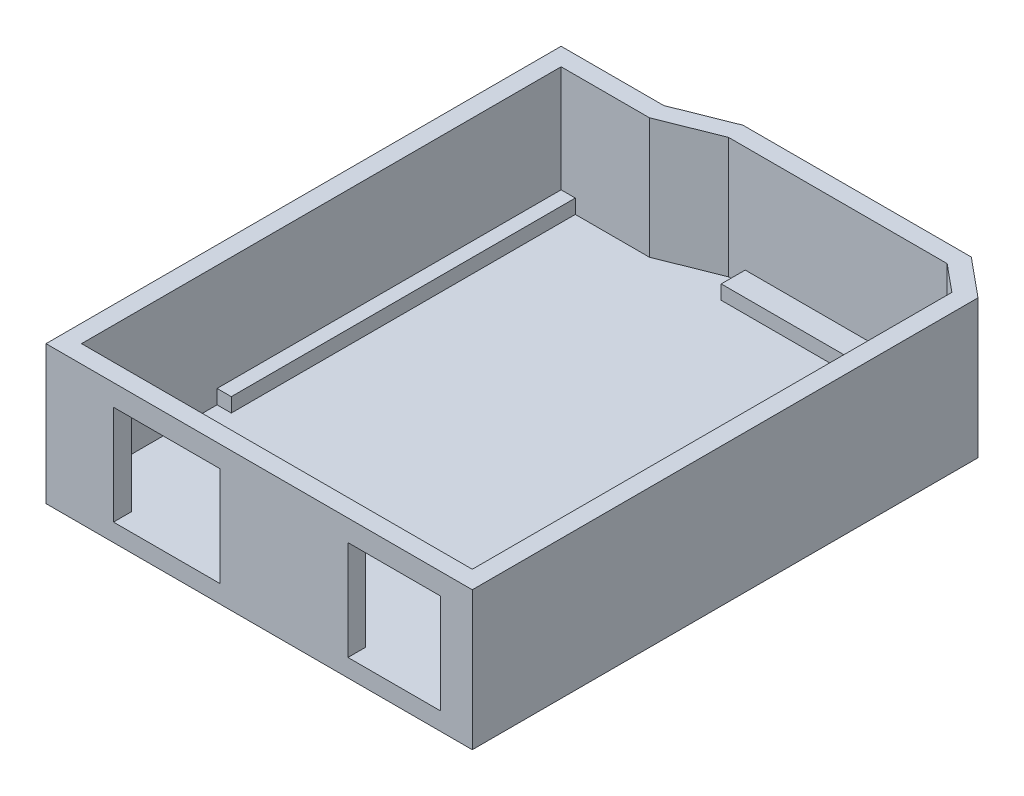
ISO-10303-21;
HEADER;
FILE_DESCRIPTION(('STEP AP214'),'2;1');
FILE_NAME('part.step','',(''),(''),'','','');
FILE_SCHEMA(('AUTOMOTIVE_DESIGN { 1 0 10303 214 1 1 1 1 }'));
ENDSEC;
DATA;
#1=APPLICATION_CONTEXT('core data for automotive mechanical design processes');
#2=APPLICATION_PROTOCOL_DEFINITION('international standard','automotive_design',2000,#1);
#3=PRODUCT_CONTEXT('',#1,'mechanical');
#4=PRODUCT('Part','Part','',(#3));
#5=PRODUCT_RELATED_PRODUCT_CATEGORY('part','',(#4));
#6=PRODUCT_DEFINITION_FORMATION('','',#4);
#7=PRODUCT_DEFINITION_CONTEXT('part definition',#1,'design');
#8=PRODUCT_DEFINITION('design','',#6,#7);
#9=PRODUCT_DEFINITION_SHAPE('','',#8);
#10=(LENGTH_UNIT() NAMED_UNIT(*) SI_UNIT(.MILLI.,.METRE.));
#11=(NAMED_UNIT(*) PLANE_ANGLE_UNIT() SI_UNIT($,.RADIAN.));
#12=(NAMED_UNIT(*) SI_UNIT($,.STERADIAN.) SOLID_ANGLE_UNIT());
#13=UNCERTAINTY_MEASURE_WITH_UNIT(LENGTH_MEASURE(1.E-05),#10,'distance_accuracy_value','');
#14=(GEOMETRIC_REPRESENTATION_CONTEXT(3) GLOBAL_UNCERTAINTY_ASSIGNED_CONTEXT((#13)) GLOBAL_UNIT_ASSIGNED_CONTEXT((#10,
#11,#12)) REPRESENTATION_CONTEXT('',''));
#15=CARTESIAN_POINT('',(0.,0.,0.));
#16=DIRECTION('',(0.,0.,1.));
#17=DIRECTION('',(1.,0.,0.));
#18=AXIS2_PLACEMENT_3D('',#15,#16,#17);
#19=CARTESIAN_POINT('',(0.,0.,0.));
#20=DIRECTION('',(0.,1.,0.));
#21=DIRECTION('',(0.,0.,1.));
#22=AXIS2_PLACEMENT_3D('',#19,#20,#21);
#23=PLANE('',#22);
#24=DIRECTION('',(1.,0.,0.));
#25=VECTOR('',#24,1.);
#26=CARTESIAN_POINT('',(22.7347806435726,0.,-67.3020667080368));
#27=LINE('',#26,#25);
#28=CARTESIAN_POINT('',(22.7347806435726,0.,-67.3020667080368));
#29=VERTEX_POINT('',#28);
#30=CARTESIAN_POINT('',(48.8818209057946,0.,-67.3020667080368));
#31=VERTEX_POINT('',#30);
#32=EDGE_CURVE('E919',#29,#31,#27,.T.);
#33=ORIENTED_EDGE('',*,*,#32,.F.);
#34=DIRECTION('',(0.,0.,1.));
#35=VECTOR('',#34,1.);
#36=CARTESIAN_POINT('',(22.7347806435726,0.,-67.3020667080368));
#37=LINE('',#36,#35);
#38=CARTESIAN_POINT('',(22.7347806435726,0.,-70.6768395355411));
#39=VERTEX_POINT('',#38);
#40=EDGE_CURVE('E278',#39,#29,#37,.T.);
#41=ORIENTED_EDGE('',*,*,#40,.F.);
#42=DIRECTION('',(-1.,0.,0.));
#43=VECTOR('',#42,1.);
#44=CARTESIAN_POINT('',(20.3927963137128,0.,-70.6768395355411));
#45=LINE('',#44,#43);
#46=CARTESIAN_POINT('',(20.3927963137128,0.,-70.6768395355411));
#47=VERTEX_POINT('',#46);
#48=EDGE_CURVE('E465',#39,#47,#45,.T.);
#49=ORIENTED_EDGE('',*,*,#48,.T.);
#50=DIRECTION('',(-0.928750661509082,0.,0.370705015809662));
#51=VECTOR('',#50,1.);
#52=CARTESIAN_POINT('',(12.4336598188969,0.,-67.5));
#53=LINE('',#52,#51);
#54=CARTESIAN_POINT('',(12.4336598188969,0.,-67.5));
#55=VERTEX_POINT('',#54);
#56=EDGE_CURVE('E470',#47,#55,#53,.T.);
#57=ORIENTED_EDGE('',*,*,#56,.T.);
#58=DIRECTION('',(-1.,0.,0.));
#59=VECTOR('',#58,1.);
#60=CARTESIAN_POINT('',(0.,0.,-67.5));
#61=LINE('',#60,#59);
#62=CARTESIAN_POINT('',(2.,0.,-67.5));
#63=VERTEX_POINT('',#62);
#64=EDGE_CURVE('E473',#55,#63,#61,.T.);
#65=ORIENTED_EDGE('',*,*,#64,.T.);
#66=DIRECTION('',(0.,0.,-1.));
#67=VECTOR('',#66,1.);
#68=CARTESIAN_POINT('',(2.,0.,-69.0781391182962));
#69=LINE('',#68,#67);
#70=CARTESIAN_POINT('',(2.00000000000001,0.,-19.0781391182962));
#71=VERTEX_POINT('',#70);
#72=EDGE_CURVE('E323',#71,#63,#69,.T.);
#73=ORIENTED_EDGE('',*,*,#72,.F.);
#74=DIRECTION('',(1.,0.,0.));
#75=VECTOR('',#74,1.);
#76=CARTESIAN_POINT('',(0.,0.,-19.0781391182962));
#77=LINE('',#76,#75);
#78=CARTESIAN_POINT('',(0.,0.,-19.0781391182962));
#79=VERTEX_POINT('',#78);
#80=EDGE_CURVE('E318',#79,#71,#77,.T.);
#81=ORIENTED_EDGE('',*,*,#80,.F.);
#82=DIRECTION('',(0.,0.,1.));
#83=VECTOR('',#82,1.);
#84=CARTESIAN_POINT('',(0.,0.,0.));
#85=LINE('',#84,#83);
#86=CARTESIAN_POINT('',(0.,0.,0.));
#87=VERTEX_POINT('',#86);
#88=EDGE_CURVE('E433',#79,#87,#85,.T.);
#89=ORIENTED_EDGE('',*,*,#88,.T.);
#90=DIRECTION('',(1.,0.,0.));
#91=VECTOR('',#90,1.);
#92=CARTESIAN_POINT('',(0.,0.,0.));
#93=LINE('',#92,#91);
#94=CARTESIAN_POINT('',(7.,0.,0.));
#95=VERTEX_POINT('',#94);
#96=EDGE_CURVE('E453',#87,#95,#93,.T.);
#97=ORIENTED_EDGE('',*,*,#96,.T.);
#98=DIRECTION('',(0.,0.,-1.));
#99=VECTOR('',#98,1.);
#100=CARTESIAN_POINT('',(7.,0.,4.));
#101=LINE('',#100,#99);
#102=CARTESIAN_POINT('',(7.,0.,2.5));
#103=VERTEX_POINT('',#102);
#104=EDGE_CURVE('E369',#103,#95,#101,.T.);
#105=ORIENTED_EDGE('',*,*,#104,.F.);
#106=DIRECTION('',(-1.,0.,0.));
#107=VECTOR('',#106,1.);
#108=CARTESIAN_POINT('',(0.,0.,2.5));
#109=LINE('',#108,#107);
#110=CARTESIAN_POINT('',(22.,0.,2.5));
#111=VERTEX_POINT('',#110);
#112=EDGE_CURVE('E412',#111,#103,#109,.T.);
#113=ORIENTED_EDGE('',*,*,#112,.F.);
#114=DIRECTION('',(0.,0.,-1.));
#115=VECTOR('',#114,1.);
#116=CARTESIAN_POINT('',(22.,0.,4.));
#117=LINE('',#116,#115);
#118=CARTESIAN_POINT('',(22.,0.,0.));
#119=VERTEX_POINT('',#118);
#120=EDGE_CURVE('E361',#111,#119,#117,.T.);
#121=ORIENTED_EDGE('',*,*,#120,.T.);
#122=CARTESIAN_POINT('',(40.,0.,0.));
#123=VERTEX_POINT('',#122);
#124=EDGE_CURVE('E458',#119,#123,#93,.T.);
#125=ORIENTED_EDGE('',*,*,#124,.T.);
#126=DIRECTION('',(0.,0.,-1.));
#127=VECTOR('',#126,1.);
#128=CARTESIAN_POINT('',(40.,0.,4.));
#129=LINE('',#128,#127);
#130=CARTESIAN_POINT('',(40.,0.,2.5));
#131=VERTEX_POINT('',#130);
#132=EDGE_CURVE('E353',#131,#123,#129,.T.);
#133=ORIENTED_EDGE('',*,*,#132,.F.);
#134=DIRECTION('',(-1.,0.,0.));
#135=VECTOR('',#134,1.);
#136=CARTESIAN_POINT('',(0.,0.,2.5));
#137=LINE('',#136,#135);
#138=CARTESIAN_POINT('',(53.,0.,2.5));
#139=VERTEX_POINT('',#138);
#140=EDGE_CURVE('E404',#139,#131,#137,.T.);
#141=ORIENTED_EDGE('',*,*,#140,.F.);
#142=DIRECTION('',(0.,0.,-1.));
#143=VECTOR('',#142,1.);
#144=CARTESIAN_POINT('',(53.,0.,4.));
#145=LINE('',#144,#143);
#146=CARTESIAN_POINT('',(53.,0.,0.));
#147=VERTEX_POINT('',#146);
#148=EDGE_CURVE('E388',#139,#147,#145,.T.);
#149=ORIENTED_EDGE('',*,*,#148,.T.);
#150=CARTESIAN_POINT('',(55.,0.,0.));
#151=VERTEX_POINT('',#150);
#152=EDGE_CURVE('E428',#147,#151,#93,.T.);
#153=ORIENTED_EDGE('',*,*,#152,.T.);
#154=DIRECTION('',(0.,0.,-1.));
#155=VECTOR('',#154,1.);
#156=CARTESIAN_POINT('',(55.,0.,0.));
#157=LINE('',#156,#155);
#158=CARTESIAN_POINT('',(55.,0.,-19.0781391182962));
#159=VERTEX_POINT('',#158);
#160=EDGE_CURVE('E457',#151,#159,#157,.T.);
#161=ORIENTED_EDGE('',*,*,#160,.T.);
#162=DIRECTION('',(1.,0.,0.));
#163=VECTOR('',#162,1.);
#164=CARTESIAN_POINT('',(55.,0.,-19.0781391182962));
#165=LINE('',#164,#163);
#166=CARTESIAN_POINT('',(53.,0.,-19.0781391182962));
#167=VERTEX_POINT('',#166);
#168=EDGE_CURVE('E293',#167,#159,#165,.T.);
#169=ORIENTED_EDGE('',*,*,#168,.F.);
#170=DIRECTION('',(0.,0.,1.));
#171=VECTOR('',#170,1.);
#172=CARTESIAN_POINT('',(53.,0.,-69.0781391182962));
#173=LINE('',#172,#171);
#174=CARTESIAN_POINT('',(53.,0.,-69.0781391182962));
#175=VERTEX_POINT('',#174);
#176=EDGE_CURVE('E285',#175,#167,#173,.T.);
#177=ORIENTED_EDGE('',*,*,#176,.F.);
#178=DIRECTION('',(-1.,0.,0.));
#179=VECTOR('',#178,1.);
#180=CARTESIAN_POINT('',(55.,0.,-69.0781391182962));
#181=LINE('',#180,#179);
#182=CARTESIAN_POINT('',(53.0913380999779,0.,-69.0781391182962));
#183=VERTEX_POINT('',#182);
#184=EDGE_CURVE('E281',#183,#175,#181,.T.);
#185=ORIENTED_EDGE('',*,*,#184,.F.);
#186=DIRECTION('',(-0.770680459779966,0.,-0.637221805114468));
#187=VECTOR('',#186,1.);
#188=CARTESIAN_POINT('',(55.,0.,-67.5));
#189=LINE('',#188,#187);
#190=CARTESIAN_POINT('',(51.1578085774102,0.,-70.6768395355411));
#191=VERTEX_POINT('',#190);
#192=EDGE_CURVE('E462',#183,#191,#189,.T.);
#193=ORIENTED_EDGE('',*,*,#192,.T.);
#194=CARTESIAN_POINT('',(48.8818209057946,0.,-70.6768395355411));
#195=VERTEX_POINT('',#194);
#196=EDGE_CURVE('E466',#191,#195,#45,.T.);
#197=ORIENTED_EDGE('',*,*,#196,.T.);
#198=DIRECTION('',(0.,0.,-1.));
#199=VECTOR('',#198,1.);
#200=CARTESIAN_POINT('',(48.8818209057946,0.,-67.3020667080368));
#201=LINE('',#200,#199);
#202=EDGE_CURVE('E274',#31,#195,#201,.T.);
#203=ORIENTED_EDGE('',*,*,#202,.F.);
#204=EDGE_LOOP('',(#33,#41,#49,#57,#65,#73,#81,#89,#97,#105,#113,#121,#125,#133,#141,#149,#153,
#161,#169,#177,#185,#193,#197,#203));
#205=FACE_BOUND('',#204,.T.);
#206=ADVANCED_FACE('F38',(#205),#23,.T.);
#207=CARTESIAN_POINT('',(20.3927963137128,17.,-70.6768395355411));
#208=DIRECTION('',(0.,0.,1.));
#209=DIRECTION('',(1.,0.,0.));
#210=AXIS2_PLACEMENT_3D('',#207,#208,#209);
#211=PLANE('',#210);
#212=ORIENTED_EDGE('',*,*,#48,.F.);
#213=DIRECTION('',(0.,-1.,0.));
#214=VECTOR('',#213,1.);
#215=CARTESIAN_POINT('',(22.7347806435726,2.,-70.6768395355411));
#216=LINE('',#215,#214);
#217=CARTESIAN_POINT('',(22.7347806435726,2.,-70.6768395355411));
#218=VERTEX_POINT('',#217);
#219=EDGE_CURVE('E925',#218,#39,#216,.T.);
#220=ORIENTED_EDGE('',*,*,#219,.F.);
#221=DIRECTION('',(-1.,0.,0.));
#222=VECTOR('',#221,1.);
#223=CARTESIAN_POINT('',(22.7347806435726,2.,-70.6768395355411));
#224=LINE('',#223,#222);
#225=CARTESIAN_POINT('',(48.8818209057946,2.,-70.6768395355411));
#226=VERTEX_POINT('',#225);
#227=EDGE_CURVE('E270',#226,#218,#224,.T.);
#228=ORIENTED_EDGE('',*,*,#227,.F.);
#229=DIRECTION('',(0.,-1.,0.));
#230=VECTOR('',#229,1.);
#231=CARTESIAN_POINT('',(48.8818209057946,2.,-70.6768395355411));
#232=LINE('',#231,#230);
#233=EDGE_CURVE('E54',#226,#195,#232,.T.);
#234=ORIENTED_EDGE('',*,*,#233,.T.);
#235=ORIENTED_EDGE('',*,*,#196,.F.);
#236=DIRECTION('',(0.,-1.,0.));
#237=VECTOR('',#236,1.);
#238=CARTESIAN_POINT('',(51.1578085774102,17.,-70.6768395355411));
#239=LINE('',#238,#237);
#240=CARTESIAN_POINT('',(51.1578085774102,17.,-70.6768395355411));
#241=VERTEX_POINT('',#240);
#242=EDGE_CURVE('E494',#241,#191,#239,.T.);
#243=ORIENTED_EDGE('',*,*,#242,.F.);
#244=DIRECTION('',(-1.,0.,0.));
#245=VECTOR('',#244,1.);
#246=CARTESIAN_POINT('',(20.3927963137128,17.,-70.6768395355411));
#247=LINE('',#246,#245);
#248=CARTESIAN_POINT('',(20.3927963137128,17.,-70.6768395355411));
#249=VERTEX_POINT('',#248);
#250=EDGE_CURVE('E439',#241,#249,#247,.T.);
#251=ORIENTED_EDGE('',*,*,#250,.T.);
#252=DIRECTION('',(0.,-1.,0.));
#253=VECTOR('',#252,1.);
#254=CARTESIAN_POINT('',(20.3927963137128,17.,-70.6768395355411));
#255=LINE('',#254,#253);
#256=EDGE_CURVE('E490',#249,#47,#255,.T.);
#257=ORIENTED_EDGE('',*,*,#256,.T.);
#258=EDGE_LOOP('',(#212,#220,#228,#234,#235,#243,#251,#257));
#259=FACE_BOUND('',#258,.T.);
#260=ADVANCED_FACE('F600',(#259),#211,.T.);
#261=CARTESIAN_POINT('',(55.,17.,0.));
#262=DIRECTION('',(-1.,0.,0.));
#263=DIRECTION('',(0.,0.,1.));
#264=AXIS2_PLACEMENT_3D('',#261,#262,#263);
#265=PLANE('',#264);
#266=DIRECTION('',(0.,0.,-1.));
#267=VECTOR('',#266,1.);
#268=CARTESIAN_POINT('',(55.,2.,-69.0781391182962));
#269=LINE('',#268,#267);
#270=CARTESIAN_POINT('',(55.,2.,-19.0781391182962));
#271=VERTEX_POINT('',#270);
#272=CARTESIAN_POINT('',(55.,2.,-67.5));
#273=VERTEX_POINT('',#272);
#274=EDGE_CURVE('E62',#271,#273,#269,.T.);
#275=ORIENTED_EDGE('',*,*,#274,.F.);
#276=DIRECTION('',(0.,-1.,0.));
#277=VECTOR('',#276,1.);
#278=CARTESIAN_POINT('',(55.,2.,-19.0781391182962));
#279=LINE('',#278,#277);
#280=EDGE_CURVE('E301',#271,#159,#279,.T.);
#281=ORIENTED_EDGE('',*,*,#280,.T.);
#282=ORIENTED_EDGE('',*,*,#160,.F.);
#283=DIRECTION('',(0.,-1.,0.));
#284=VECTOR('',#283,1.);
#285=CARTESIAN_POINT('',(55.,17.,0.));
#286=LINE('',#285,#284);
#287=CARTESIAN_POINT('',(55.,17.,0.));
#288=VERTEX_POINT('',#287);
#289=EDGE_CURVE('E502',#288,#151,#286,.T.);
#290=ORIENTED_EDGE('',*,*,#289,.F.);
#291=DIRECTION('',(0.,0.,-1.));
#292=VECTOR('',#291,1.);
#293=CARTESIAN_POINT('',(55.,17.,0.));
#294=LINE('',#293,#292);
#295=CARTESIAN_POINT('',(55.,17.,-67.5));
#296=VERTEX_POINT('',#295);
#297=EDGE_CURVE('E432',#288,#296,#294,.T.);
#298=ORIENTED_EDGE('',*,*,#297,.T.);
#299=DIRECTION('',(0.,-1.,0.));
#300=VECTOR('',#299,1.);
#301=CARTESIAN_POINT('',(55.,17.,-67.5));
#302=LINE('',#301,#300);
#303=EDGE_CURVE('E498',#296,#273,#302,.T.);
#304=ORIENTED_EDGE('',*,*,#303,.T.);
#305=EDGE_LOOP('',(#275,#281,#282,#290,#298,#304));
#306=FACE_BOUND('',#305,.T.);
#307=ADVANCED_FACE('F585',(#306),#265,.T.);
#308=CARTESIAN_POINT('',(55.,17.,-67.5));
#309=DIRECTION('',(-0.637221805114468,0.,0.770680459779966));
#310=DIRECTION('',(0.770680459779966,0.,0.637221805114468));
#311=AXIS2_PLACEMENT_3D('',#308,#309,#310);
#312=PLANE('',#311);
#313=ORIENTED_EDGE('',*,*,#192,.F.);
#314=DIRECTION('',(0.,1.,0.));
#315=VECTOR('',#314,1.);
#316=CARTESIAN_POINT('',(53.0913380999779,17.,-69.0781391182962));
#317=LINE('',#316,#315);
#318=CARTESIAN_POINT('',(53.0913380999779,2.,-69.0781391182962));
#319=VERTEX_POINT('',#318);
#320=EDGE_CURVE('E11',#183,#319,#317,.T.);
#321=ORIENTED_EDGE('',*,*,#320,.T.);
#322=DIRECTION('',(0.770680459779966,0.,0.637221805114468));
#323=VECTOR('',#322,1.);
#324=CARTESIAN_POINT('',(55.,2.,-67.5));
#325=LINE('',#324,#323);
#326=EDGE_CURVE('E47',#319,#273,#325,.T.);
#327=ORIENTED_EDGE('',*,*,#326,.T.);
#328=ORIENTED_EDGE('',*,*,#303,.F.);
#329=DIRECTION('',(-0.770680459779966,0.,-0.637221805114468));
#330=VECTOR('',#329,1.);
#331=CARTESIAN_POINT('',(55.,17.,-67.5));
#332=LINE('',#331,#330);
#333=EDGE_CURVE('E436',#296,#241,#332,.T.);
#334=ORIENTED_EDGE('',*,*,#333,.T.);
#335=ORIENTED_EDGE('',*,*,#242,.T.);
#336=EDGE_LOOP('',(#313,#321,#327,#328,#334,#335));
#337=FACE_BOUND('',#336,.T.);
#338=ADVANCED_FACE('F581',(#337),#312,.T.);
#339=CARTESIAN_POINT('',(0.,17.,-67.5));
#340=DIRECTION('',(0.,0.,1.));
#341=DIRECTION('',(1.,0.,0.));
#342=AXIS2_PLACEMENT_3D('',#339,#340,#341);
#343=PLANE('',#342);
#344=DIRECTION('',(-1.,0.,0.));
#345=VECTOR('',#344,1.);
#346=CARTESIAN_POINT('',(0.,2.,-67.5));
#347=LINE('',#346,#345);
#348=CARTESIAN_POINT('',(2.,2.,-67.5));
#349=VERTEX_POINT('',#348);
#350=CARTESIAN_POINT('',(0.,2.,-67.5));
#351=VERTEX_POINT('',#350);
#352=EDGE_CURVE('E345',#349,#351,#347,.T.);
#353=ORIENTED_EDGE('',*,*,#352,.F.);
#354=DIRECTION('',(0.,-1.,0.));
#355=VECTOR('',#354,1.);
#356=CARTESIAN_POINT('',(2.,17.,-67.5));
#357=LINE('',#356,#355);
#358=EDGE_CURVE('E341',#349,#63,#357,.T.);
#359=ORIENTED_EDGE('',*,*,#358,.T.);
#360=ORIENTED_EDGE('',*,*,#64,.F.);
#361=DIRECTION('',(0.,-1.,0.));
#362=VECTOR('',#361,1.);
#363=CARTESIAN_POINT('',(12.4336598188969,17.,-67.5));
#364=LINE('',#363,#362);
#365=CARTESIAN_POINT('',(12.4336598188969,17.,-67.5));
#366=VERTEX_POINT('',#365);
#367=EDGE_CURVE('E486',#366,#55,#364,.T.);
#368=ORIENTED_EDGE('',*,*,#367,.F.);
#369=DIRECTION('',(-1.,0.,0.));
#370=VECTOR('',#369,1.);
#371=CARTESIAN_POINT('',(0.,17.,-67.5));
#372=LINE('',#371,#370);
#373=CARTESIAN_POINT('',(0.,17.,-67.5));
#374=VERTEX_POINT('',#373);
#375=EDGE_CURVE('E445',#366,#374,#372,.T.);
#376=ORIENTED_EDGE('',*,*,#375,.T.);
#377=DIRECTION('',(0.,-1.,0.));
#378=VECTOR('',#377,1.);
#379=CARTESIAN_POINT('',(0.,17.,-67.5));
#380=LINE('',#379,#378);
#381=EDGE_CURVE('E482',#374,#351,#380,.T.);
#382=ORIENTED_EDGE('',*,*,#381,.T.);
#383=EDGE_LOOP('',(#353,#359,#360,#368,#376,#382));
#384=FACE_BOUND('',#383,.T.);
#385=ADVANCED_FACE('F667',(#384),#343,.T.);
#386=CARTESIAN_POINT('',(0.,17.,0.));
#387=DIRECTION('',(1.,0.,0.));
#388=DIRECTION('',(0.,0.,-1.));
#389=AXIS2_PLACEMENT_3D('',#386,#387,#388);
#390=PLANE('',#389);
#391=ORIENTED_EDGE('',*,*,#88,.F.);
#392=DIRECTION('',(0.,-1.,0.));
#393=VECTOR('',#392,1.);
#394=CARTESIAN_POINT('',(0.,2.,-19.0781391182962));
#395=LINE('',#394,#393);
#396=CARTESIAN_POINT('',(0.,2.,-19.0781391182962));
#397=VERTEX_POINT('',#396);
#398=EDGE_CURVE('E338',#397,#79,#395,.T.);
#399=ORIENTED_EDGE('',*,*,#398,.F.);
#400=DIRECTION('',(0.,0.,1.));
#401=VECTOR('',#400,1.);
#402=CARTESIAN_POINT('',(0.,2.,-69.0781391182962));
#403=LINE('',#402,#401);
#404=EDGE_CURVE('E319',#351,#397,#403,.T.);
#405=ORIENTED_EDGE('',*,*,#404,.F.);
#406=ORIENTED_EDGE('',*,*,#381,.F.);
#407=DIRECTION('',(0.,0.,1.));
#408=VECTOR('',#407,1.);
#409=CARTESIAN_POINT('',(0.,17.,0.));
#410=LINE('',#409,#408);
#411=CARTESIAN_POINT('',(0.,17.,0.));
#412=VERTEX_POINT('',#411);
#413=EDGE_CURVE('E449',#374,#412,#410,.T.);
#414=ORIENTED_EDGE('',*,*,#413,.T.);
#415=DIRECTION('',(0.,-1.,0.));
#416=VECTOR('',#415,1.);
#417=CARTESIAN_POINT('',(0.,17.,0.));
#418=LINE('',#417,#416);
#419=EDGE_CURVE('E452',#412,#87,#418,.T.);
#420=ORIENTED_EDGE('',*,*,#419,.T.);
#421=EDGE_LOOP('',(#391,#399,#405,#406,#414,#420));
#422=FACE_BOUND('',#421,.T.);
#423=ADVANCED_FACE('F664',(#422),#390,.T.);
#424=CARTESIAN_POINT('',(0.,17.,2.5));
#425=DIRECTION('',(0.,0.,-1.));
#426=DIRECTION('',(-1.,0.,0.));
#427=AXIS2_PLACEMENT_3D('',#424,#425,#426);
#428=PLANE('',#427);
#429=DIRECTION('',(1.,0.,0.));
#430=VECTOR('',#429,1.);
#431=CARTESIAN_POINT('',(0.,14.,2.5));
#432=LINE('',#431,#430);
#433=CARTESIAN_POINT('',(7.,14.,2.5));
#434=VERTEX_POINT('',#433);
#435=CARTESIAN_POINT('',(22.,14.,2.5));
#436=VERTEX_POINT('',#435);
#437=EDGE_CURVE('E420',#434,#436,#432,.T.);
#438=ORIENTED_EDGE('',*,*,#437,.T.);
#439=DIRECTION('',(0.,-1.,0.));
#440=VECTOR('',#439,1.);
#441=CARTESIAN_POINT('',(22.,17.,2.5));
#442=LINE('',#441,#440);
#443=EDGE_CURVE('E424',#436,#111,#442,.T.);
#444=ORIENTED_EDGE('',*,*,#443,.T.);
#445=ORIENTED_EDGE('',*,*,#112,.T.);
#446=DIRECTION('',(0.,1.,0.));
#447=VECTOR('',#446,1.);
#448=CARTESIAN_POINT('',(7.,17.,2.5));
#449=LINE('',#448,#447);
#450=EDGE_CURVE('E416',#103,#434,#449,.T.);
#451=ORIENTED_EDGE('',*,*,#450,.T.);
#452=EDGE_LOOP('',(#438,#444,#445,#451));
#453=FACE_BOUND('',#452,.T.);
#454=ORIENTED_EDGE('',*,*,#140,.T.);
#455=DIRECTION('',(0.,1.,0.));
#456=VECTOR('',#455,1.);
#457=CARTESIAN_POINT('',(40.,17.,2.5));
#458=LINE('',#457,#456);
#459=CARTESIAN_POINT('',(40.,14.,2.5));
#460=VERTEX_POINT('',#459);
#461=EDGE_CURVE('E408',#131,#460,#458,.T.);
#462=ORIENTED_EDGE('',*,*,#461,.T.);
#463=DIRECTION('',(1.,0.,0.));
#464=VECTOR('',#463,1.);
#465=CARTESIAN_POINT('',(0.,14.,2.5));
#466=LINE('',#465,#464);
#467=CARTESIAN_POINT('',(53.,14.,2.5));
#468=VERTEX_POINT('',#467);
#469=EDGE_CURVE('E365',#460,#468,#466,.T.);
#470=ORIENTED_EDGE('',*,*,#469,.T.);
#471=DIRECTION('',(0.,-1.,0.));
#472=VECTOR('',#471,1.);
#473=CARTESIAN_POINT('',(53.,17.,2.5));
#474=LINE('',#473,#472);
#475=EDGE_CURVE('E400',#468,#139,#474,.T.);
#476=ORIENTED_EDGE('',*,*,#475,.T.);
#477=EDGE_LOOP('',(#454,#462,#470,#476));
#478=FACE_BOUND('',#477,.T.);
#479=DIRECTION('',(1.,0.,0.));
#480=VECTOR('',#479,1.);
#481=CARTESIAN_POINT('',(0.,-2.5,2.5));
#482=LINE('',#481,#480);
#483=CARTESIAN_POINT('',(-2.5,-2.5,2.5));
#484=VERTEX_POINT('',#483);
#485=CARTESIAN_POINT('',(57.5,-2.5,2.5));
#486=VERTEX_POINT('',#485);
#487=EDGE_CURVE('E506',#484,#486,#482,.T.);
#488=ORIENTED_EDGE('',*,*,#487,.T.);
#489=DIRECTION('',(0.,-1.,0.));
#490=VECTOR('',#489,1.);
#491=CARTESIAN_POINT('',(57.5,17.,2.5));
#492=LINE('',#491,#490);
#493=CARTESIAN_POINT('',(57.5,17.,2.5));
#494=VERTEX_POINT('',#493);
#495=EDGE_CURVE('E511',#494,#486,#492,.T.);
#496=ORIENTED_EDGE('',*,*,#495,.F.);
#497=DIRECTION('',(1.,0.,0.));
#498=VECTOR('',#497,1.);
#499=CARTESIAN_POINT('',(0.,17.,2.5));
#500=LINE('',#499,#498);
#501=CARTESIAN_POINT('',(-2.5,17.,2.5));
#502=VERTEX_POINT('',#501);
#503=EDGE_CURVE('E557',#502,#494,#500,.T.);
#504=ORIENTED_EDGE('',*,*,#503,.F.);
#505=DIRECTION('',(0.,-1.,0.));
#506=VECTOR('',#505,1.);
#507=CARTESIAN_POINT('',(-2.5,17.,2.5));
#508=LINE('',#507,#506);
#509=EDGE_CURVE('E516',#502,#484,#508,.T.);
#510=ORIENTED_EDGE('',*,*,#509,.T.);
#511=EDGE_LOOP('',(#488,#496,#504,#510));
#512=FACE_BOUND('',#511,.T.);
#513=ADVANCED_FACE('F638',(#453,#478,#512),#428,.F.);
#514=CARTESIAN_POINT('',(57.5,17.,0.));
#515=DIRECTION('',(-1.,0.,0.));
#516=DIRECTION('',(0.,0.,1.));
#517=AXIS2_PLACEMENT_3D('',#514,#515,#516);
#518=PLANE('',#517);
#519=DIRECTION('',(0.,0.,-1.));
#520=VECTOR('',#519,1.);
#521=CARTESIAN_POINT('',(57.5,-2.5,0.));
#522=LINE('',#521,#520);
#523=CARTESIAN_POINT('',(57.5,-2.5,-68.6768113174593));
#524=VERTEX_POINT('',#523);
#525=EDGE_CURVE('E510',#486,#524,#522,.T.);
#526=ORIENTED_EDGE('',*,*,#525,.T.);
#527=DIRECTION('',(0.,-1.,0.));
#528=VECTOR('',#527,1.);
#529=CARTESIAN_POINT('',(57.5,17.,-68.6768113174593));
#530=LINE('',#529,#528);
#531=CARTESIAN_POINT('',(57.5,17.,-68.6768113174593));
#532=VERTEX_POINT('',#531);
#533=EDGE_CURVE('E515',#532,#524,#530,.T.);
#534=ORIENTED_EDGE('',*,*,#533,.F.);
#535=DIRECTION('',(0.,0.,-1.));
#536=VECTOR('',#535,1.);
#537=CARTESIAN_POINT('',(57.5,17.,0.));
#538=LINE('',#537,#536);
#539=EDGE_CURVE('E561',#494,#532,#538,.T.);
#540=ORIENTED_EDGE('',*,*,#539,.F.);
#541=ORIENTED_EDGE('',*,*,#495,.T.);
#542=EDGE_LOOP('',(#526,#534,#540,#541));
#543=FACE_BOUND('',#542,.T.);
#544=ADVANCED_FACE('F687',(#543),#518,.F.);
#545=CARTESIAN_POINT('',(56.5930545127862,17.,-69.4267011494499));
#546=DIRECTION('',(-0.637221805114468,0.,0.770680459779966));
#547=DIRECTION('',(0.770680459779966,0.,0.637221805114468));
#548=AXIS2_PLACEMENT_3D('',#545,#546,#547);
#549=PLANE('',#548);
#550=DIRECTION('',(-0.770680459779966,0.,-0.637221805114468));
#551=VECTOR('',#550,1.);
#552=CARTESIAN_POINT('',(56.5930545127862,-2.5,-69.4267011494499));
#553=LINE('',#552,#551);
#554=CARTESIAN_POINT('',(52.0574935002247,-2.5,-73.1768395355411));
#555=VERTEX_POINT('',#554);
#556=EDGE_CURVE('E524',#524,#555,#553,.T.);
#557=ORIENTED_EDGE('',*,*,#556,.T.);
#558=DIRECTION('',(0.,-1.,0.));
#559=VECTOR('',#558,1.);
#560=CARTESIAN_POINT('',(52.0574935002247,17.,-73.1768395355411));
#561=LINE('',#560,#559);
#562=CARTESIAN_POINT('',(52.0574935002247,17.,-73.1768395355411));
#563=VERTEX_POINT('',#562);
#564=EDGE_CURVE('E528',#563,#555,#561,.T.);
#565=ORIENTED_EDGE('',*,*,#564,.F.);
#566=DIRECTION('',(-0.770680459779966,0.,-0.637221805114468));
#567=VECTOR('',#566,1.);
#568=CARTESIAN_POINT('',(56.5930545127862,17.,-69.4267011494499));
#569=LINE('',#568,#567);
#570=EDGE_CURVE('E564',#532,#563,#569,.T.);
#571=ORIENTED_EDGE('',*,*,#570,.F.);
#572=ORIENTED_EDGE('',*,*,#533,.T.);
#573=EDGE_LOOP('',(#557,#565,#571,#572));
#574=FACE_BOUND('',#573,.T.);
#575=ADVANCED_FACE('F691',(#574),#549,.F.);
#576=CARTESIAN_POINT('',(20.3927963137128,17.,-73.1768395355411));
#577=DIRECTION('',(0.,0.,1.));
#578=DIRECTION('',(1.,0.,0.));
#579=AXIS2_PLACEMENT_3D('',#576,#577,#578);
#580=PLANE('',#579);
#581=DIRECTION('',(-1.,0.,0.));
#582=VECTOR('',#581,1.);
#583=CARTESIAN_POINT('',(20.3927963137128,-2.5,-73.1768395355411));
#584=LINE('',#583,#582);
#585=CARTESIAN_POINT('',(19.9122974301511,-2.5,-73.1768395355411));
#586=VERTEX_POINT('',#585);
#587=EDGE_CURVE('E531',#555,#586,#584,.T.);
#588=ORIENTED_EDGE('',*,*,#587,.T.);
#589=DIRECTION('',(0.,-1.,0.));
#590=VECTOR('',#589,1.);
#591=CARTESIAN_POINT('',(19.9122974301511,17.,-73.1768395355411));
#592=LINE('',#591,#590);
#593=CARTESIAN_POINT('',(19.9122974301511,17.,-73.1768395355411));
#594=VERTEX_POINT('',#593);
#595=EDGE_CURVE('E535',#594,#586,#592,.T.);
#596=ORIENTED_EDGE('',*,*,#595,.F.);
#597=DIRECTION('',(-1.,0.,0.));
#598=VECTOR('',#597,1.);
#599=CARTESIAN_POINT('',(20.3927963137128,17.,-73.1768395355411));
#600=LINE('',#599,#598);
#601=EDGE_CURVE('E567',#563,#594,#600,.T.);
#602=ORIENTED_EDGE('',*,*,#601,.F.);
#603=ORIENTED_EDGE('',*,*,#564,.T.);
#604=EDGE_LOOP('',(#588,#596,#602,#603));
#605=FACE_BOUND('',#604,.T.);
#606=ADVANCED_FACE('F695',(#605),#580,.F.);
#607=CARTESIAN_POINT('',(11.5068972793727,17.,-69.8218766537727));
#608=DIRECTION('',(0.370705015809662,0.,0.928750661509083));
#609=DIRECTION('',(0.928750661509082,0.,-0.370705015809662));
#610=AXIS2_PLACEMENT_3D('',#607,#608,#609);
#611=PLANE('',#610);
#612=DIRECTION('',(-0.928750661509082,0.,0.370705015809662));
#613=VECTOR('',#612,1.);
#614=CARTESIAN_POINT('',(11.5068972793727,-2.5,-69.8218766537727));
#615=LINE('',#614,#613);
#616=CARTESIAN_POINT('',(11.9531609353351,-2.5,-70.));
#617=VERTEX_POINT('',#616);
#618=EDGE_CURVE('E538',#586,#617,#615,.T.);
#619=ORIENTED_EDGE('',*,*,#618,.T.);
#620=DIRECTION('',(0.,-1.,0.));
#621=VECTOR('',#620,1.);
#622=CARTESIAN_POINT('',(11.9531609353351,17.,-70.));
#623=LINE('',#622,#621);
#624=CARTESIAN_POINT('',(11.9531609353351,17.,-70.));
#625=VERTEX_POINT('',#624);
#626=EDGE_CURVE('E542',#625,#617,#623,.T.);
#627=ORIENTED_EDGE('',*,*,#626,.F.);
#628=DIRECTION('',(-0.928750661509082,0.,0.370705015809662));
#629=VECTOR('',#628,1.);
#630=CARTESIAN_POINT('',(11.5068972793727,17.,-69.8218766537727));
#631=LINE('',#630,#629);
#632=EDGE_CURVE('E570',#594,#625,#631,.T.);
#633=ORIENTED_EDGE('',*,*,#632,.F.);
#634=ORIENTED_EDGE('',*,*,#595,.T.);
#635=EDGE_LOOP('',(#619,#627,#633,#634));
#636=FACE_BOUND('',#635,.T.);
#637=ADVANCED_FACE('F699',(#636),#611,.F.);
#638=CARTESIAN_POINT('',(0.,17.,-70.));
#639=DIRECTION('',(0.,0.,1.));
#640=DIRECTION('',(1.,0.,0.));
#641=AXIS2_PLACEMENT_3D('',#638,#639,#640);
#642=PLANE('',#641);
#643=DIRECTION('',(-1.,0.,0.));
#644=VECTOR('',#643,1.);
#645=CARTESIAN_POINT('',(0.,-2.5,-70.));
#646=LINE('',#645,#644);
#647=CARTESIAN_POINT('',(-2.5,-2.5,-70.));
#648=VERTEX_POINT('',#647);
#649=EDGE_CURVE('E545',#617,#648,#646,.T.);
#650=ORIENTED_EDGE('',*,*,#649,.T.);
#651=DIRECTION('',(0.,-1.,0.));
#652=VECTOR('',#651,1.);
#653=CARTESIAN_POINT('',(-2.5,17.,-70.));
#654=LINE('',#653,#652);
#655=CARTESIAN_POINT('',(-2.5,17.,-70.));
#656=VERTEX_POINT('',#655);
#657=EDGE_CURVE('E520',#656,#648,#654,.T.);
#658=ORIENTED_EDGE('',*,*,#657,.F.);
#659=DIRECTION('',(-1.,0.,0.));
#660=VECTOR('',#659,1.);
#661=CARTESIAN_POINT('',(0.,17.,-70.));
#662=LINE('',#661,#660);
#663=EDGE_CURVE('E573',#625,#656,#662,.T.);
#664=ORIENTED_EDGE('',*,*,#663,.F.);
#665=ORIENTED_EDGE('',*,*,#626,.T.);
#666=EDGE_LOOP('',(#650,#658,#664,#665));
#667=FACE_BOUND('',#666,.T.);
#668=ADVANCED_FACE('F703',(#667),#642,.F.);
#669=CARTESIAN_POINT('',(-2.5,17.,0.));
#670=DIRECTION('',(1.,0.,0.));
#671=DIRECTION('',(0.,0.,-1.));
#672=AXIS2_PLACEMENT_3D('',#669,#670,#671);
#673=PLANE('',#672);
#674=DIRECTION('',(0.,0.,1.));
#675=VECTOR('',#674,1.);
#676=CARTESIAN_POINT('',(-2.5,-2.5,0.));
#677=LINE('',#676,#675);
#678=EDGE_CURVE('E551',#648,#484,#677,.T.);
#679=ORIENTED_EDGE('',*,*,#678,.T.);
#680=ORIENTED_EDGE('',*,*,#509,.F.);
#681=DIRECTION('',(0.,0.,1.));
#682=VECTOR('',#681,1.);
#683=CARTESIAN_POINT('',(-2.5,17.,0.));
#684=LINE('',#683,#682);
#685=EDGE_CURVE('E521',#656,#502,#684,.T.);
#686=ORIENTED_EDGE('',*,*,#685,.F.);
#687=ORIENTED_EDGE('',*,*,#657,.T.);
#688=EDGE_LOOP('',(#679,#680,#686,#687));
#689=FACE_BOUND('',#688,.T.);
#690=ADVANCED_FACE('F684',(#689),#673,.F.);
#691=CARTESIAN_POINT('',(0.,17.,0.));
#692=DIRECTION('',(0.,1.,0.));
#693=DIRECTION('',(0.,0.,1.));
#694=AXIS2_PLACEMENT_3D('',#691,#692,#693);
#695=PLANE('',#694);
#696=DIRECTION('',(1.,0.,0.));
#697=VECTOR('',#696,1.);
#698=CARTESIAN_POINT('',(0.,17.,0.));
#699=LINE('',#698,#697);
#700=EDGE_CURVE('E429',#412,#288,#699,.T.);
#701=ORIENTED_EDGE('',*,*,#700,.F.);
#702=ORIENTED_EDGE('',*,*,#413,.F.);
#703=ORIENTED_EDGE('',*,*,#375,.F.);
#704=DIRECTION('',(-0.928750661509082,0.,0.370705015809662));
#705=VECTOR('',#704,1.);
#706=CARTESIAN_POINT('',(12.4336598188969,17.,-67.5));
#707=LINE('',#706,#705);
#708=EDGE_CURVE('E442',#249,#366,#707,.T.);
#709=ORIENTED_EDGE('',*,*,#708,.F.);
#710=ORIENTED_EDGE('',*,*,#250,.F.);
#711=ORIENTED_EDGE('',*,*,#333,.F.);
#712=ORIENTED_EDGE('',*,*,#297,.F.);
#713=EDGE_LOOP('',(#701,#702,#703,#709,#710,#711,#712));
#714=FACE_BOUND('',#713,.T.);
#715=ORIENTED_EDGE('',*,*,#503,.T.);
#716=ORIENTED_EDGE('',*,*,#539,.T.);
#717=ORIENTED_EDGE('',*,*,#570,.T.);
#718=ORIENTED_EDGE('',*,*,#601,.T.);
#719=ORIENTED_EDGE('',*,*,#632,.T.);
#720=ORIENTED_EDGE('',*,*,#663,.T.);
#721=ORIENTED_EDGE('',*,*,#685,.T.);
#722=EDGE_LOOP('',(#715,#716,#717,#718,#719,#720,#721));
#723=FACE_BOUND('',#722,.T.);
#724=ADVANCED_FACE('F591',(#714,#723),#695,.T.);
#725=CARTESIAN_POINT('',(0.,-2.5,0.));
#726=DIRECTION('',(0.,1.,0.));
#727=DIRECTION('',(0.,0.,1.));
#728=AXIS2_PLACEMENT_3D('',#725,#726,#727);
#729=PLANE('',#728);
#730=ORIENTED_EDGE('',*,*,#487,.F.);
#731=ORIENTED_EDGE('',*,*,#678,.F.);
#732=ORIENTED_EDGE('',*,*,#649,.F.);
#733=ORIENTED_EDGE('',*,*,#618,.F.);
#734=ORIENTED_EDGE('',*,*,#587,.F.);
#735=ORIENTED_EDGE('',*,*,#556,.F.);
#736=ORIENTED_EDGE('',*,*,#525,.F.);
#737=EDGE_LOOP('',(#730,#731,#732,#733,#734,#735,#736));
#738=FACE_BOUND('',#737,.T.);
#739=ADVANCED_FACE('F40',(#738),#729,.F.);
#740=CARTESIAN_POINT('',(0.,17.,0.));
#741=DIRECTION('',(0.,0.,-1.));
#742=DIRECTION('',(-1.,0.,0.));
#743=AXIS2_PLACEMENT_3D('',#740,#741,#742);
#744=PLANE('',#743);
#745=DIRECTION('',(0.,-1.,0.));
#746=VECTOR('',#745,1.);
#747=CARTESIAN_POINT('',(22.,14.,0.));
#748=LINE('',#747,#746);
#749=CARTESIAN_POINT('',(22.,14.,0.));
#750=VERTEX_POINT('',#749);
#751=EDGE_CURVE('E349',#750,#119,#748,.T.);
#752=ORIENTED_EDGE('',*,*,#751,.F.);
#753=DIRECTION('',(1.,0.,0.));
#754=VECTOR('',#753,1.);
#755=CARTESIAN_POINT('',(22.,14.,0.));
#756=LINE('',#755,#754);
#757=CARTESIAN_POINT('',(7.,14.,0.));
#758=VERTEX_POINT('',#757);
#759=EDGE_CURVE('E357',#758,#750,#756,.T.);
#760=ORIENTED_EDGE('',*,*,#759,.F.);
#761=DIRECTION('',(0.,1.,0.));
#762=VECTOR('',#761,1.);
#763=CARTESIAN_POINT('',(7.,14.,0.));
#764=LINE('',#763,#762);
#765=EDGE_CURVE('E352',#95,#758,#764,.T.);
#766=ORIENTED_EDGE('',*,*,#765,.F.);
#767=ORIENTED_EDGE('',*,*,#96,.F.);
#768=ORIENTED_EDGE('',*,*,#419,.F.);
#769=ORIENTED_EDGE('',*,*,#700,.T.);
#770=ORIENTED_EDGE('',*,*,#289,.T.);
#771=ORIENTED_EDGE('',*,*,#152,.F.);
#772=DIRECTION('',(0.,-1.,0.));
#773=VECTOR('',#772,1.);
#774=CARTESIAN_POINT('',(53.,14.,0.));
#775=LINE('',#774,#773);
#776=CARTESIAN_POINT('',(53.,14.,0.));
#777=VERTEX_POINT('',#776);
#778=EDGE_CURVE('E382',#777,#147,#775,.T.);
#779=ORIENTED_EDGE('',*,*,#778,.F.);
#780=DIRECTION('',(1.,0.,0.));
#781=VECTOR('',#780,1.);
#782=CARTESIAN_POINT('',(40.,14.,0.));
#783=LINE('',#782,#781);
#784=CARTESIAN_POINT('',(40.,14.,0.));
#785=VERTEX_POINT('',#784);
#786=EDGE_CURVE('E378',#785,#777,#783,.T.);
#787=ORIENTED_EDGE('',*,*,#786,.F.);
#788=DIRECTION('',(0.,1.,0.));
#789=VECTOR('',#788,1.);
#790=CARTESIAN_POINT('',(40.,14.,0.));
#791=LINE('',#790,#789);
#792=EDGE_CURVE('E348',#123,#785,#791,.T.);
#793=ORIENTED_EDGE('',*,*,#792,.F.);
#794=ORIENTED_EDGE('',*,*,#124,.F.);
#795=EDGE_LOOP('',(#752,#760,#766,#767,#768,#769,#770,#771,#779,#787,#793,#794));
#796=FACE_BOUND('',#795,.T.);
#797=ADVANCED_FACE('F631',(#796),#744,.T.);
#798=CARTESIAN_POINT('',(12.4336598188969,17.,-67.5));
#799=DIRECTION('',(0.370705015809662,0.,0.928750661509083));
#800=DIRECTION('',(0.928750661509082,0.,-0.370705015809662));
#801=AXIS2_PLACEMENT_3D('',#798,#799,#800);
#802=PLANE('',#801);
#803=ORIENTED_EDGE('',*,*,#56,.F.);
#804=ORIENTED_EDGE('',*,*,#256,.F.);
#805=ORIENTED_EDGE('',*,*,#708,.T.);
#806=ORIENTED_EDGE('',*,*,#367,.T.);
#807=EDGE_LOOP('',(#803,#804,#805,#806));
#808=FACE_BOUND('',#807,.T.);
#809=ADVANCED_FACE('F672',(#808),#802,.T.);
#810=CARTESIAN_POINT('',(40.,14.,4.));
#811=DIRECTION('',(-1.,0.,0.));
#812=DIRECTION('',(0.,0.,1.));
#813=AXIS2_PLACEMENT_3D('',#810,#811,#812);
#814=PLANE('',#813);
#815=ORIENTED_EDGE('',*,*,#132,.T.);
#816=ORIENTED_EDGE('',*,*,#792,.T.);
#817=DIRECTION('',(0.,0.,-1.));
#818=VECTOR('',#817,1.);
#819=CARTESIAN_POINT('',(40.,14.,4.));
#820=LINE('',#819,#818);
#821=EDGE_CURVE('E385',#460,#785,#820,.T.);
#822=ORIENTED_EDGE('',*,*,#821,.F.);
#823=ORIENTED_EDGE('',*,*,#461,.F.);
#824=EDGE_LOOP('',(#815,#816,#822,#823));
#825=FACE_BOUND('',#824,.T.);
#826=ADVANCED_FACE('F636',(#825),#814,.F.);
#827=CARTESIAN_POINT('',(53.,14.,4.));
#828=DIRECTION('',(1.,0.,0.));
#829=DIRECTION('',(0.,0.,-1.));
#830=AXIS2_PLACEMENT_3D('',#827,#828,#829);
#831=PLANE('',#830);
#832=DIRECTION('',(0.,0.,-1.));
#833=VECTOR('',#832,1.);
#834=CARTESIAN_POINT('',(53.,14.,4.));
#835=LINE('',#834,#833);
#836=EDGE_CURVE('E392',#468,#777,#835,.T.);
#837=ORIENTED_EDGE('',*,*,#836,.T.);
#838=ORIENTED_EDGE('',*,*,#778,.T.);
#839=ORIENTED_EDGE('',*,*,#148,.F.);
#840=ORIENTED_EDGE('',*,*,#475,.F.);
#841=EDGE_LOOP('',(#837,#838,#839,#840));
#842=FACE_BOUND('',#841,.T.);
#843=ADVANCED_FACE('F642',(#842),#831,.F.);
#844=CARTESIAN_POINT('',(40.,14.,4.));
#845=DIRECTION('',(0.,1.,0.));
#846=DIRECTION('',(-1.,0.,0.));
#847=AXIS2_PLACEMENT_3D('',#844,#845,#846);
#848=PLANE('',#847);
#849=ORIENTED_EDGE('',*,*,#821,.T.);
#850=ORIENTED_EDGE('',*,*,#786,.T.);
#851=ORIENTED_EDGE('',*,*,#836,.F.);
#852=ORIENTED_EDGE('',*,*,#469,.F.);
#853=EDGE_LOOP('',(#849,#850,#851,#852));
#854=FACE_BOUND('',#853,.T.);
#855=ADVANCED_FACE('F644',(#854),#848,.F.);
#856=CARTESIAN_POINT('',(22.,14.,4.));
#857=DIRECTION('',(1.,0.,0.));
#858=DIRECTION('',(0.,1.,0.));
#859=AXIS2_PLACEMENT_3D('',#856,#857,#858);
#860=PLANE('',#859);
#861=DIRECTION('',(0.,0.,-1.));
#862=VECTOR('',#861,1.);
#863=CARTESIAN_POINT('',(22.,14.,4.));
#864=LINE('',#863,#862);
#865=EDGE_CURVE('E362',#436,#750,#864,.T.);
#866=ORIENTED_EDGE('',*,*,#865,.T.);
#867=ORIENTED_EDGE('',*,*,#751,.T.);
#868=ORIENTED_EDGE('',*,*,#120,.F.);
#869=ORIENTED_EDGE('',*,*,#443,.F.);
#870=EDGE_LOOP('',(#866,#867,#868,#869));
#871=FACE_BOUND('',#870,.T.);
#872=ADVANCED_FACE('F646',(#871),#860,.F.);
#873=CARTESIAN_POINT('',(22.,14.,4.));
#874=DIRECTION('',(0.,1.,0.));
#875=DIRECTION('',(-1.,0.,0.));
#876=AXIS2_PLACEMENT_3D('',#873,#874,#875);
#877=PLANE('',#876);
#878=DIRECTION('',(0.,0.,-1.));
#879=VECTOR('',#878,1.);
#880=CARTESIAN_POINT('',(7.,14.,4.));
#881=LINE('',#880,#879);
#882=EDGE_CURVE('E366',#434,#758,#881,.T.);
#883=ORIENTED_EDGE('',*,*,#882,.T.);
#884=ORIENTED_EDGE('',*,*,#759,.T.);
#885=ORIENTED_EDGE('',*,*,#865,.F.);
#886=ORIENTED_EDGE('',*,*,#437,.F.);
#887=EDGE_LOOP('',(#883,#884,#885,#886));
#888=FACE_BOUND('',#887,.T.);
#889=ADVANCED_FACE('F652',(#888),#877,.F.);
#890=CARTESIAN_POINT('',(7.,14.,4.));
#891=DIRECTION('',(-1.,0.,0.));
#892=DIRECTION('',(0.,-1.,0.));
#893=AXIS2_PLACEMENT_3D('',#890,#891,#892);
#894=PLANE('',#893);
#895=ORIENTED_EDGE('',*,*,#104,.T.);
#896=ORIENTED_EDGE('',*,*,#765,.T.);
#897=ORIENTED_EDGE('',*,*,#882,.F.);
#898=ORIENTED_EDGE('',*,*,#450,.F.);
#899=EDGE_LOOP('',(#895,#896,#897,#898));
#900=FACE_BOUND('',#899,.T.);
#901=ADVANCED_FACE('F773',(#900),#894,.F.);
#902=CARTESIAN_POINT('',(0.,2.,-19.0781391182962));
#903=DIRECTION('',(0.,0.,-1.));
#904=DIRECTION('',(-1.,0.,0.));
#905=AXIS2_PLACEMENT_3D('',#902,#903,#904);
#906=PLANE('',#905);
#907=ORIENTED_EDGE('',*,*,#80,.T.);
#908=DIRECTION('',(0.,-1.,0.));
#909=VECTOR('',#908,1.);
#910=CARTESIAN_POINT('',(2.00000000000001,2.,-19.0781391182962));
#911=LINE('',#910,#909);
#912=CARTESIAN_POINT('',(2.00000000000001,2.,-19.0781391182962));
#913=VERTEX_POINT('',#912);
#914=EDGE_CURVE('E330',#913,#71,#911,.T.);
#915=ORIENTED_EDGE('',*,*,#914,.F.);
#916=DIRECTION('',(1.,0.,0.));
#917=VECTOR('',#916,1.);
#918=CARTESIAN_POINT('',(0.,2.,-19.0781391182962));
#919=LINE('',#918,#917);
#920=EDGE_CURVE('E322',#397,#913,#919,.T.);
#921=ORIENTED_EDGE('',*,*,#920,.F.);
#922=ORIENTED_EDGE('',*,*,#398,.T.);
#923=EDGE_LOOP('',(#907,#915,#921,#922));
#924=FACE_BOUND('',#923,.T.);
#925=ADVANCED_FACE('F783',(#924),#906,.F.);
#926=CARTESIAN_POINT('',(2.,2.,-69.0781391182962));
#927=DIRECTION('',(-1.,0.,0.));
#928=DIRECTION('',(0.,0.,1.));
#929=AXIS2_PLACEMENT_3D('',#926,#927,#928);
#930=PLANE('',#929);
#931=ORIENTED_EDGE('',*,*,#358,.F.);
#932=DIRECTION('',(0.,0.,-1.));
#933=VECTOR('',#932,1.);
#934=CARTESIAN_POINT('',(2.,2.,-69.0781391182962));
#935=LINE('',#934,#933);
#936=EDGE_CURVE('E326',#913,#349,#935,.T.);
#937=ORIENTED_EDGE('',*,*,#936,.F.);
#938=ORIENTED_EDGE('',*,*,#914,.T.);
#939=ORIENTED_EDGE('',*,*,#72,.T.);
#940=EDGE_LOOP('',(#931,#937,#938,#939));
#941=FACE_BOUND('',#940,.T.);
#942=ADVANCED_FACE('F817',(#941),#930,.F.);
#943=CARTESIAN_POINT('',(0.,2.,0.));
#944=DIRECTION('',(0.,1.,0.));
#945=DIRECTION('',(0.,0.,1.));
#946=AXIS2_PLACEMENT_3D('',#943,#944,#945);
#947=PLANE('',#946);
#948=ORIENTED_EDGE('',*,*,#936,.T.);
#949=ORIENTED_EDGE('',*,*,#352,.T.);
#950=ORIENTED_EDGE('',*,*,#404,.T.);
#951=ORIENTED_EDGE('',*,*,#920,.T.);
#952=EDGE_LOOP('',(#948,#949,#950,#951));
#953=FACE_BOUND('',#952,.T.);
#954=ADVANCED_FACE('F827',(#953),#947,.T.);
#955=CARTESIAN_POINT('',(55.,2.,-69.0781391182962));
#956=DIRECTION('',(0.,0.,1.));
#957=DIRECTION('',(1.,0.,0.));
#958=AXIS2_PLACEMENT_3D('',#955,#956,#957);
#959=PLANE('',#958);
#960=ORIENTED_EDGE('',*,*,#320,.F.);
#961=ORIENTED_EDGE('',*,*,#184,.T.);
#962=DIRECTION('',(0.,-1.,0.));
#963=VECTOR('',#962,1.);
#964=CARTESIAN_POINT('',(53.,2.,-69.0781391182962));
#965=LINE('',#964,#963);
#966=CARTESIAN_POINT('',(53.,2.,-69.0781391182962));
#967=VERTEX_POINT('',#966);
#968=EDGE_CURVE('E314',#967,#175,#965,.T.);
#969=ORIENTED_EDGE('',*,*,#968,.F.);
#970=DIRECTION('',(-1.,0.,0.));
#971=VECTOR('',#970,1.);
#972=CARTESIAN_POINT('',(55.,2.,-69.0781391182962));
#973=LINE('',#972,#971);
#974=EDGE_CURVE('E292',#319,#967,#973,.T.);
#975=ORIENTED_EDGE('',*,*,#974,.F.);
#976=EDGE_LOOP('',(#960,#961,#969,#975));
#977=FACE_BOUND('',#976,.T.);
#978=ADVANCED_FACE('F609',(#977),#959,.F.);
#979=CARTESIAN_POINT('',(53.,2.,-69.0781391182962));
#980=DIRECTION('',(1.,0.,0.));
#981=DIRECTION('',(0.,0.,-1.));
#982=AXIS2_PLACEMENT_3D('',#979,#980,#981);
#983=PLANE('',#982);
#984=ORIENTED_EDGE('',*,*,#176,.T.);
#985=DIRECTION('',(0.,-1.,0.));
#986=VECTOR('',#985,1.);
#987=CARTESIAN_POINT('',(53.,2.,-19.0781391182962));
#988=LINE('',#987,#986);
#989=CARTESIAN_POINT('',(53.,2.,-19.0781391182962));
#990=VERTEX_POINT('',#989);
#991=EDGE_CURVE('E310',#990,#167,#988,.T.);
#992=ORIENTED_EDGE('',*,*,#991,.F.);
#993=DIRECTION('',(0.,0.,1.));
#994=VECTOR('',#993,1.);
#995=CARTESIAN_POINT('',(53.,2.,-69.0781391182962));
#996=LINE('',#995,#994);
#997=EDGE_CURVE('E296',#967,#990,#996,.T.);
#998=ORIENTED_EDGE('',*,*,#997,.F.);
#999=ORIENTED_EDGE('',*,*,#968,.T.);
#1000=EDGE_LOOP('',(#984,#992,#998,#999));
#1001=FACE_BOUND('',#1000,.T.);
#1002=ADVANCED_FACE('F612',(#1001),#983,.F.);
#1003=CARTESIAN_POINT('',(55.,2.,-19.0781391182962));
#1004=DIRECTION('',(0.,0.,-1.));
#1005=DIRECTION('',(-1.,0.,0.));
#1006=AXIS2_PLACEMENT_3D('',#1003,#1004,#1005);
#1007=PLANE('',#1006);
#1008=ORIENTED_EDGE('',*,*,#168,.T.);
#1009=ORIENTED_EDGE('',*,*,#280,.F.);
#1010=DIRECTION('',(1.,0.,0.));
#1011=VECTOR('',#1010,1.);
#1012=CARTESIAN_POINT('',(55.,2.,-19.0781391182962));
#1013=LINE('',#1012,#1011);
#1014=EDGE_CURVE('E299',#990,#271,#1013,.T.);
#1015=ORIENTED_EDGE('',*,*,#1014,.F.);
#1016=ORIENTED_EDGE('',*,*,#991,.T.);
#1017=EDGE_LOOP('',(#1008,#1009,#1015,#1016));
#1018=FACE_BOUND('',#1017,.T.);
#1019=ADVANCED_FACE('F618',(#1018),#1007,.F.);
#1020=CARTESIAN_POINT('',(0.,2.,0.));
#1021=DIRECTION('',(0.,-1.,0.));
#1022=DIRECTION('',(0.,0.,-1.));
#1023=AXIS2_PLACEMENT_3D('',#1020,#1021,#1022);
#1024=PLANE('',#1023);
#1025=ORIENTED_EDGE('',*,*,#326,.F.);
#1026=ORIENTED_EDGE('',*,*,#974,.T.);
#1027=ORIENTED_EDGE('',*,*,#997,.T.);
#1028=ORIENTED_EDGE('',*,*,#1014,.T.);
#1029=ORIENTED_EDGE('',*,*,#274,.T.);
#1030=EDGE_LOOP('',(#1025,#1026,#1027,#1028,#1029));
#1031=FACE_BOUND('',#1030,.T.);
#1032=ADVANCED_FACE('F615',(#1031),#1024,.F.);
#1033=CARTESIAN_POINT('',(22.7347806435726,2.,-67.3020667080368));
#1034=DIRECTION('',(1.,0.,0.));
#1035=DIRECTION('',(0.,0.,-1.));
#1036=AXIS2_PLACEMENT_3D('',#1033,#1034,#1035);
#1037=PLANE('',#1036);
#1038=ORIENTED_EDGE('',*,*,#40,.T.);
#1039=DIRECTION('',(0.,-1.,0.));
#1040=VECTOR('',#1039,1.);
#1041=CARTESIAN_POINT('',(22.7347806435726,2.,-67.3020667080368));
#1042=LINE('',#1041,#1040);
#1043=CARTESIAN_POINT('',(22.7347806435726,2.,-67.3020667080368));
#1044=VERTEX_POINT('',#1043);
#1045=EDGE_CURVE('E258',#1044,#29,#1042,.T.);
#1046=ORIENTED_EDGE('',*,*,#1045,.F.);
#1047=DIRECTION('',(0.,0.,1.));
#1048=VECTOR('',#1047,1.);
#1049=CARTESIAN_POINT('',(22.7347806435726,2.,-67.3020667080368));
#1050=LINE('',#1049,#1048);
#1051=EDGE_CURVE('E265',#218,#1044,#1050,.T.);
#1052=ORIENTED_EDGE('',*,*,#1051,.F.);
#1053=ORIENTED_EDGE('',*,*,#219,.T.);
#1054=EDGE_LOOP('',(#1038,#1046,#1052,#1053));
#1055=FACE_BOUND('',#1054,.T.);
#1056=ADVANCED_FACE('F276',(#1055),#1037,.F.);
#1057=CARTESIAN_POINT('',(22.7347806435726,2.,-67.3020667080368));
#1058=DIRECTION('',(0.,0.,-1.));
#1059=DIRECTION('',(-1.,0.,0.));
#1060=AXIS2_PLACEMENT_3D('',#1057,#1058,#1059);
#1061=PLANE('',#1060);
#1062=ORIENTED_EDGE('',*,*,#32,.T.);
#1063=DIRECTION('',(0.,-1.,0.));
#1064=VECTOR('',#1063,1.);
#1065=CARTESIAN_POINT('',(48.8818209057946,2.,-67.3020667080368));
#1066=LINE('',#1065,#1064);
#1067=CARTESIAN_POINT('',(48.8818209057946,2.,-67.3020667080368));
#1068=VERTEX_POINT('',#1067);
#1069=EDGE_CURVE('E261',#1068,#31,#1066,.T.);
#1070=ORIENTED_EDGE('',*,*,#1069,.F.);
#1071=DIRECTION('',(1.,0.,0.));
#1072=VECTOR('',#1071,1.);
#1073=CARTESIAN_POINT('',(22.7347806435726,2.,-67.3020667080368));
#1074=LINE('',#1073,#1072);
#1075=EDGE_CURVE('E254',#1044,#1068,#1074,.T.);
#1076=ORIENTED_EDGE('',*,*,#1075,.F.);
#1077=ORIENTED_EDGE('',*,*,#1045,.T.);
#1078=EDGE_LOOP('',(#1062,#1070,#1076,#1077));
#1079=FACE_BOUND('',#1078,.T.);
#1080=ADVANCED_FACE('F256',(#1079),#1061,.F.);
#1081=CARTESIAN_POINT('',(48.8818209057946,2.,-67.3020667080368));
#1082=DIRECTION('',(-1.,0.,0.));
#1083=DIRECTION('',(0.,0.,1.));
#1084=AXIS2_PLACEMENT_3D('',#1081,#1082,#1083);
#1085=PLANE('',#1084);
#1086=ORIENTED_EDGE('',*,*,#202,.T.);
#1087=ORIENTED_EDGE('',*,*,#233,.F.);
#1088=DIRECTION('',(0.,0.,-1.));
#1089=VECTOR('',#1088,1.);
#1090=CARTESIAN_POINT('',(48.8818209057946,2.,-67.3020667080368));
#1091=LINE('',#1090,#1089);
#1092=EDGE_CURVE('E264',#1068,#226,#1091,.T.);
#1093=ORIENTED_EDGE('',*,*,#1092,.F.);
#1094=ORIENTED_EDGE('',*,*,#1069,.T.);
#1095=EDGE_LOOP('',(#1086,#1087,#1093,#1094));
#1096=FACE_BOUND('',#1095,.T.);
#1097=ADVANCED_FACE('F898',(#1096),#1085,.F.);
#1098=CARTESIAN_POINT('',(0.,2.,0.));
#1099=DIRECTION('',(0.,-1.,0.));
#1100=DIRECTION('',(0.,0.,-1.));
#1101=AXIS2_PLACEMENT_3D('',#1098,#1099,#1100);
#1102=PLANE('',#1101);
#1103=ORIENTED_EDGE('',*,*,#1051,.T.);
#1104=ORIENTED_EDGE('',*,*,#1075,.T.);
#1105=ORIENTED_EDGE('',*,*,#1092,.T.);
#1106=ORIENTED_EDGE('',*,*,#227,.T.);
#1107=EDGE_LOOP('',(#1103,#1104,#1105,#1106));
#1108=FACE_BOUND('',#1107,.T.);
#1109=ADVANCED_FACE('F268',(#1108),#1102,.F.);
#1110=CLOSED_SHELL('',(#206,#260,#307,#338,#385,#423,#513,#544,#575,#606,#637,#668,#690,#724,
#739,#797,#809,#826,#843,#855,#872,#889,#901,#925,#942,#954,#978,#1002,#1019,#1032,#1056,#1080,
#1097,#1109));
#1111=MANIFOLD_SOLID_BREP('B2',#1110);
#1112=ADVANCED_BREP_SHAPE_REPRESENTATION('',(#18,#1111),#14);
#1113=SHAPE_DEFINITION_REPRESENTATION(#9,#1112);
ENDSEC;
END-ISO-10303-21;
